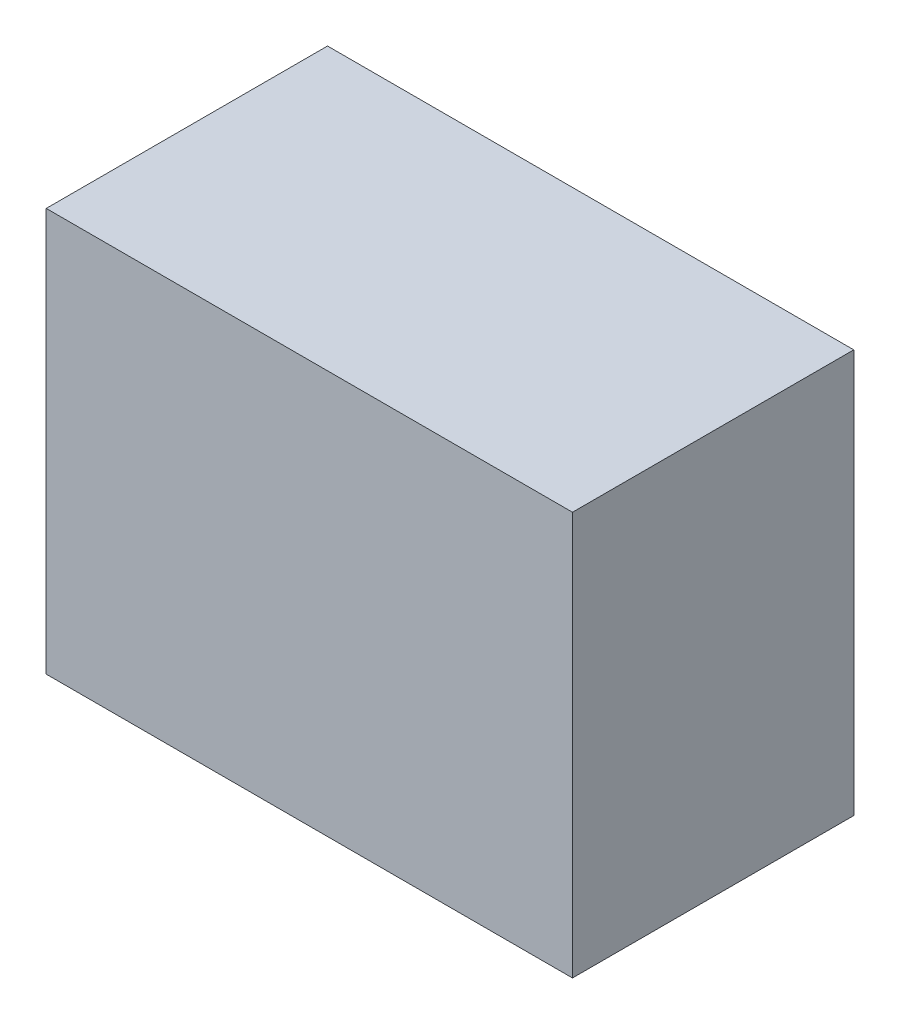
ISO-10303-21;
HEADER;
FILE_DESCRIPTION(('STEP AP214'),'2;1');
FILE_NAME('part.step','',(''),(''),'','','');
FILE_SCHEMA(('AUTOMOTIVE_DESIGN { 1 0 10303 214 1 1 1 1 }'));
ENDSEC;
DATA;
#1=APPLICATION_CONTEXT('core data for automotive mechanical design processes');
#2=APPLICATION_PROTOCOL_DEFINITION('international standard','automotive_design',2000,#1);
#3=PRODUCT_CONTEXT('',#1,'mechanical');
#4=PRODUCT('Part','Part','',(#3));
#5=PRODUCT_RELATED_PRODUCT_CATEGORY('part','',(#4));
#6=PRODUCT_DEFINITION_FORMATION('','',#4);
#7=PRODUCT_DEFINITION_CONTEXT('part definition',#1,'design');
#8=PRODUCT_DEFINITION('design','',#6,#7);
#9=PRODUCT_DEFINITION_SHAPE('','',#8);
#10=(LENGTH_UNIT() NAMED_UNIT(*) SI_UNIT(.MILLI.,.METRE.));
#11=(NAMED_UNIT(*) PLANE_ANGLE_UNIT() SI_UNIT($,.RADIAN.));
#12=(NAMED_UNIT(*) SI_UNIT($,.STERADIAN.) SOLID_ANGLE_UNIT());
#13=UNCERTAINTY_MEASURE_WITH_UNIT(LENGTH_MEASURE(1.E-05),#10,'distance_accuracy_value','');
#14=(GEOMETRIC_REPRESENTATION_CONTEXT(3) GLOBAL_UNCERTAINTY_ASSIGNED_CONTEXT((#13)) GLOBAL_UNIT_ASSIGNED_CONTEXT((#10,
#11,#12)) REPRESENTATION_CONTEXT('',''));
#15=CARTESIAN_POINT('',(0.,0.,0.));
#16=DIRECTION('',(0.,0.,1.));
#17=DIRECTION('',(1.,0.,0.));
#18=AXIS2_PLACEMENT_3D('',#15,#16,#17);
#19=CARTESIAN_POINT('',(49.25,-37.7499999999998,52.65));
#20=DIRECTION('',(-1.,0.,0.));
#21=DIRECTION('',(0.,0.,1.));
#22=AXIS2_PLACEMENT_3D('',#19,#20,#21);
#23=PLANE('',#22);
#24=DIRECTION('',(0.,1.,0.));
#25=VECTOR('',#24,1.);
#26=CARTESIAN_POINT('',(49.25,-37.7499999999998,0.));
#27=LINE('',#26,#25);
#28=CARTESIAN_POINT('',(49.25,-37.7499999999998,0.));
#29=VERTEX_POINT('',#28);
#30=CARTESIAN_POINT('',(49.25,37.7500000000001,0.));
#31=VERTEX_POINT('',#30);
#32=EDGE_CURVE('E113',#29,#31,#27,.T.);
#33=ORIENTED_EDGE('',*,*,#32,.T.);
#34=DIRECTION('',(0.,0.,-1.));
#35=VECTOR('',#34,1.);
#36=CARTESIAN_POINT('',(49.25,37.7500000000001,52.65));
#37=LINE('',#36,#35);
#38=CARTESIAN_POINT('',(49.25,37.7500000000001,52.65));
#39=VERTEX_POINT('',#38);
#40=EDGE_CURVE('E11',#39,#31,#37,.T.);
#41=ORIENTED_EDGE('',*,*,#40,.F.);
#42=DIRECTION('',(0.,1.,0.));
#43=VECTOR('',#42,1.);
#44=CARTESIAN_POINT('',(49.25,-37.7499999999998,52.65));
#45=LINE('',#44,#43);
#46=CARTESIAN_POINT('',(49.25,-37.7499999999998,52.65));
#47=VERTEX_POINT('',#46);
#48=EDGE_CURVE('E97',#47,#39,#45,.T.);
#49=ORIENTED_EDGE('',*,*,#48,.F.);
#50=DIRECTION('',(0.,0.,-1.));
#51=VECTOR('',#50,1.);
#52=CARTESIAN_POINT('',(49.25,-37.7499999999998,52.65));
#53=LINE('',#52,#51);
#54=EDGE_CURVE('E109',#47,#29,#53,.T.);
#55=ORIENTED_EDGE('',*,*,#54,.T.);
#56=EDGE_LOOP('',(#33,#41,#49,#55));
#57=FACE_BOUND('',#56,.T.);
#58=ADVANCED_FACE('F45',(#57),#23,.F.);
#59=CARTESIAN_POINT('',(-49.25,37.7500000000001,52.65));
#60=DIRECTION('',(0.,-1.,0.));
#61=DIRECTION('',(0.,0.,-1.));
#62=AXIS2_PLACEMENT_3D('',#59,#60,#61);
#63=PLANE('',#62);
#64=DIRECTION('',(-1.,0.,0.));
#65=VECTOR('',#64,1.);
#66=CARTESIAN_POINT('',(-49.25,37.7500000000001,0.));
#67=LINE('',#66,#65);
#68=CARTESIAN_POINT('',(-49.25,37.7500000000001,0.));
#69=VERTEX_POINT('',#68);
#70=EDGE_CURVE('E102',#31,#69,#67,.T.);
#71=ORIENTED_EDGE('',*,*,#70,.T.);
#72=DIRECTION('',(0.,0.,-1.));
#73=VECTOR('',#72,1.);
#74=CARTESIAN_POINT('',(-49.25,37.7500000000001,52.65));
#75=LINE('',#74,#73);
#76=CARTESIAN_POINT('',(-49.25,37.7500000000001,52.65));
#77=VERTEX_POINT('',#76);
#78=EDGE_CURVE('E54',#77,#69,#75,.T.);
#79=ORIENTED_EDGE('',*,*,#78,.F.);
#80=DIRECTION('',(-1.,0.,0.));
#81=VECTOR('',#80,1.);
#82=CARTESIAN_POINT('',(-49.25,37.7500000000001,52.65));
#83=LINE('',#82,#81);
#84=EDGE_CURVE('E92',#39,#77,#83,.T.);
#85=ORIENTED_EDGE('',*,*,#84,.F.);
#86=ORIENTED_EDGE('',*,*,#40,.T.);
#87=EDGE_LOOP('',(#71,#79,#85,#86));
#88=FACE_BOUND('',#87,.T.);
#89=ADVANCED_FACE('F101',(#88),#63,.F.);
#90=CARTESIAN_POINT('',(-49.25,-37.7499999999998,52.65));
#91=DIRECTION('',(1.,0.,0.));
#92=DIRECTION('',(0.,0.,-1.));
#93=AXIS2_PLACEMENT_3D('',#90,#91,#92);
#94=PLANE('',#93);
#95=DIRECTION('',(0.,-1.,0.));
#96=VECTOR('',#95,1.);
#97=CARTESIAN_POINT('',(-49.25,-37.7499999999998,0.));
#98=LINE('',#97,#96);
#99=CARTESIAN_POINT('',(-49.25,-37.7499999999998,0.));
#100=VERTEX_POINT('',#99);
#101=EDGE_CURVE('E79',#69,#100,#98,.T.);
#102=ORIENTED_EDGE('',*,*,#101,.T.);
#103=DIRECTION('',(0.,0.,-1.));
#104=VECTOR('',#103,1.);
#105=CARTESIAN_POINT('',(-49.25,-37.7499999999998,52.65));
#106=LINE('',#105,#104);
#107=CARTESIAN_POINT('',(-49.25,-37.7499999999998,52.65));
#108=VERTEX_POINT('',#107);
#109=EDGE_CURVE('E104',#108,#100,#106,.T.);
#110=ORIENTED_EDGE('',*,*,#109,.F.);
#111=DIRECTION('',(0.,-1.,0.));
#112=VECTOR('',#111,1.);
#113=CARTESIAN_POINT('',(-49.25,-37.7499999999998,52.65));
#114=LINE('',#113,#112);
#115=EDGE_CURVE('E95',#77,#108,#114,.T.);
#116=ORIENTED_EDGE('',*,*,#115,.F.);
#117=ORIENTED_EDGE('',*,*,#78,.T.);
#118=EDGE_LOOP('',(#102,#110,#116,#117));
#119=FACE_BOUND('',#118,.T.);
#120=ADVANCED_FACE('F105',(#119),#94,.F.);
#121=CARTESIAN_POINT('',(-49.25,-37.7499999999998,52.65));
#122=DIRECTION('',(0.,1.,0.));
#123=DIRECTION('',(0.,0.,1.));
#124=AXIS2_PLACEMENT_3D('',#121,#122,#123);
#125=PLANE('',#124);
#126=DIRECTION('',(1.,0.,0.));
#127=VECTOR('',#126,1.);
#128=CARTESIAN_POINT('',(-49.25,-37.7499999999998,0.));
#129=LINE('',#128,#127);
#130=EDGE_CURVE('E85',#100,#29,#129,.T.);
#131=ORIENTED_EDGE('',*,*,#130,.T.);
#132=ORIENTED_EDGE('',*,*,#54,.F.);
#133=DIRECTION('',(1.,0.,0.));
#134=VECTOR('',#133,1.);
#135=CARTESIAN_POINT('',(-49.25,-37.7499999999998,52.65));
#136=LINE('',#135,#134);
#137=EDGE_CURVE('E62',#108,#47,#136,.T.);
#138=ORIENTED_EDGE('',*,*,#137,.F.);
#139=ORIENTED_EDGE('',*,*,#109,.T.);
#140=EDGE_LOOP('',(#131,#132,#138,#139));
#141=FACE_BOUND('',#140,.T.);
#142=ADVANCED_FACE('F127',(#141),#125,.F.);
#143=CARTESIAN_POINT('',(0.,0.,52.65));
#144=DIRECTION('',(0.,0.,-1.));
#145=DIRECTION('',(-1.,0.,0.));
#146=AXIS2_PLACEMENT_3D('',#143,#144,#145);
#147=PLANE('',#146);
#148=ORIENTED_EDGE('',*,*,#48,.T.);
#149=ORIENTED_EDGE('',*,*,#84,.T.);
#150=ORIENTED_EDGE('',*,*,#115,.T.);
#151=ORIENTED_EDGE('',*,*,#137,.T.);
#152=EDGE_LOOP('',(#148,#149,#150,#151));
#153=FACE_BOUND('',#152,.T.);
#154=ADVANCED_FACE('F93',(#153),#147,.F.);
#155=CARTESIAN_POINT('',(0.,0.,0.));
#156=DIRECTION('',(0.,0.,-1.));
#157=DIRECTION('',(-1.,0.,0.));
#158=AXIS2_PLACEMENT_3D('',#155,#156,#157);
#159=PLANE('',#158);
#160=CARTESIAN_POINT('',(41.5,-30.,0.));
#161=DIRECTION('',(0.,0.,-1.));
#162=DIRECTION('',(-1.,0.,0.));
#163=AXIS2_PLACEMENT_3D('',#160,#161,#162);
#164=CIRCLE('',#163,3.4);
#165=CARTESIAN_POINT('',(38.1,-30.,0.));
#166=VERTEX_POINT('',#165);
#167=EDGE_CURVE('E138',#166,#166,#164,.T.);
#168=ORIENTED_EDGE('',*,*,#167,.F.);
#169=EDGE_LOOP('',(#168));
#170=FACE_BOUND('',#169,.T.);
#171=CARTESIAN_POINT('',(-41.5,30.,0.));
#172=DIRECTION('',(0.,0.,-1.));
#173=DIRECTION('',(-1.,0.,0.));
#174=AXIS2_PLACEMENT_3D('',#171,#172,#173);
#175=CIRCLE('',#174,3.4);
#176=CARTESIAN_POINT('',(-44.9,30.,0.));
#177=VERTEX_POINT('',#176);
#178=EDGE_CURVE('E146',#177,#177,#175,.T.);
#179=ORIENTED_EDGE('',*,*,#178,.F.);
#180=EDGE_LOOP('',(#179));
#181=FACE_BOUND('',#180,.T.);
#182=CARTESIAN_POINT('',(-41.5,-30.,0.));
#183=DIRECTION('',(0.,0.,-1.));
#184=DIRECTION('',(-1.,0.,0.));
#185=AXIS2_PLACEMENT_3D('',#182,#183,#184);
#186=CIRCLE('',#185,3.4);
#187=CARTESIAN_POINT('',(-44.9,-30.,0.));
#188=VERTEX_POINT('',#187);
#189=EDGE_CURVE('E147',#188,#188,#186,.T.);
#190=ORIENTED_EDGE('',*,*,#189,.F.);
#191=EDGE_LOOP('',(#190));
#192=FACE_BOUND('',#191,.T.);
#193=CARTESIAN_POINT('',(41.5,30.,0.));
#194=DIRECTION('',(0.,0.,-1.));
#195=DIRECTION('',(-1.,0.,0.));
#196=AXIS2_PLACEMENT_3D('',#193,#194,#195);
#197=CIRCLE('',#196,3.4);
#198=CARTESIAN_POINT('',(38.1,30.,0.));
#199=VERTEX_POINT('',#198);
#200=EDGE_CURVE('E134',#199,#199,#197,.T.);
#201=ORIENTED_EDGE('',*,*,#200,.F.);
#202=EDGE_LOOP('',(#201));
#203=FACE_BOUND('',#202,.T.);
#204=ORIENTED_EDGE('',*,*,#32,.F.);
#205=ORIENTED_EDGE('',*,*,#130,.F.);
#206=ORIENTED_EDGE('',*,*,#101,.F.);
#207=ORIENTED_EDGE('',*,*,#70,.F.);
#208=EDGE_LOOP('',(#204,#205,#206,#207));
#209=FACE_BOUND('',#208,.T.);
#210=ADVANCED_FACE('F130',(#170,#181,#192,#203,#209),#159,.T.);
#211=CARTESIAN_POINT('',(41.5,30.,6.35));
#212=DIRECTION('',(0.,0.,-1.));
#213=DIRECTION('',(-1.,0.,0.));
#214=AXIS2_PLACEMENT_3D('',#211,#212,#213);
#215=CYLINDRICAL_SURFACE('',#214,3.4);
#216=CARTESIAN_POINT('',(41.5,30.,6.35));
#217=DIRECTION('',(0.,0.,-1.));
#218=DIRECTION('',(-1.,0.,0.));
#219=AXIS2_PLACEMENT_3D('',#216,#217,#218);
#220=CIRCLE('',#219,3.4);
#221=CARTESIAN_POINT('',(38.1,30.,6.35));
#222=VERTEX_POINT('',#221);
#223=EDGE_CURVE('E117',#222,#222,#220,.T.);
#224=ORIENTED_EDGE('',*,*,#223,.F.);
#225=EDGE_LOOP('',(#224));
#226=FACE_BOUND('',#225,.T.);
#227=ORIENTED_EDGE('',*,*,#200,.T.);
#228=EDGE_LOOP('',(#227));
#229=FACE_BOUND('',#228,.T.);
#230=ADVANCED_FACE('F170',(#226,#229),#215,.F.);
#231=CARTESIAN_POINT('',(41.5,30.,6.35));
#232=DIRECTION('',(0.,0.,-1.));
#233=DIRECTION('',(-1.,0.,0.));
#234=AXIS2_PLACEMENT_3D('',#231,#232,#233);
#235=PLANE('',#234);
#236=ORIENTED_EDGE('',*,*,#223,.T.);
#237=EDGE_LOOP('',(#236));
#238=FACE_BOUND('',#237,.T.);
#239=ADVANCED_FACE('F176',(#238),#235,.T.);
#240=CARTESIAN_POINT('',(-41.5,-30.,6.35));
#241=DIRECTION('',(0.,0.,-1.));
#242=DIRECTION('',(-1.,0.,0.));
#243=AXIS2_PLACEMENT_3D('',#240,#241,#242);
#244=CYLINDRICAL_SURFACE('',#243,3.4);
#245=CARTESIAN_POINT('',(-41.5,-30.,6.35));
#246=DIRECTION('',(0.,0.,-1.));
#247=DIRECTION('',(-1.,0.,0.));
#248=AXIS2_PLACEMENT_3D('',#245,#246,#247);
#249=CIRCLE('',#248,3.4);
#250=CARTESIAN_POINT('',(-44.9,-30.,6.35));
#251=VERTEX_POINT('',#250);
#252=EDGE_CURVE('E158',#251,#251,#249,.T.);
#253=ORIENTED_EDGE('',*,*,#252,.F.);
#254=EDGE_LOOP('',(#253));
#255=FACE_BOUND('',#254,.T.);
#256=ORIENTED_EDGE('',*,*,#189,.T.);
#257=EDGE_LOOP('',(#256));
#258=FACE_BOUND('',#257,.T.);
#259=ADVANCED_FACE('F166',(#255,#258),#244,.F.);
#260=CARTESIAN_POINT('',(-41.5,-30.,6.35));
#261=DIRECTION('',(0.,0.,-1.));
#262=DIRECTION('',(-1.,0.,0.));
#263=AXIS2_PLACEMENT_3D('',#260,#261,#262);
#264=PLANE('',#263);
#265=ORIENTED_EDGE('',*,*,#252,.T.);
#266=EDGE_LOOP('',(#265));
#267=FACE_BOUND('',#266,.T.);
#268=ADVANCED_FACE('F226',(#267),#264,.T.);
#269=CARTESIAN_POINT('',(-41.5,30.,6.35));
#270=DIRECTION('',(0.,0.,-1.));
#271=DIRECTION('',(-1.,0.,0.));
#272=AXIS2_PLACEMENT_3D('',#269,#270,#271);
#273=CYLINDRICAL_SURFACE('',#272,3.4);
#274=CARTESIAN_POINT('',(-41.5,30.,6.35));
#275=DIRECTION('',(0.,0.,-1.));
#276=DIRECTION('',(-1.,0.,0.));
#277=AXIS2_PLACEMENT_3D('',#274,#275,#276);
#278=CIRCLE('',#277,3.4);
#279=CARTESIAN_POINT('',(-44.9,30.,6.35));
#280=VERTEX_POINT('',#279);
#281=EDGE_CURVE('E142',#280,#280,#278,.T.);
#282=ORIENTED_EDGE('',*,*,#281,.F.);
#283=EDGE_LOOP('',(#282));
#284=FACE_BOUND('',#283,.T.);
#285=ORIENTED_EDGE('',*,*,#178,.T.);
#286=EDGE_LOOP('',(#285));
#287=FACE_BOUND('',#286,.T.);
#288=ADVANCED_FACE('F236',(#284,#287),#273,.F.);
#289=CARTESIAN_POINT('',(-41.5,30.,6.35));
#290=DIRECTION('',(0.,0.,-1.));
#291=DIRECTION('',(-1.,0.,0.));
#292=AXIS2_PLACEMENT_3D('',#289,#290,#291);
#293=PLANE('',#292);
#294=ORIENTED_EDGE('',*,*,#281,.T.);
#295=EDGE_LOOP('',(#294));
#296=FACE_BOUND('',#295,.T.);
#297=ADVANCED_FACE('F246',(#296),#293,.T.);
#298=CARTESIAN_POINT('',(41.5,-30.,6.35));
#299=DIRECTION('',(0.,0.,-1.));
#300=DIRECTION('',(-1.,0.,0.));
#301=AXIS2_PLACEMENT_3D('',#298,#299,#300);
#302=CYLINDRICAL_SURFACE('',#301,3.4);
#303=CARTESIAN_POINT('',(41.5,-30.,6.35));
#304=DIRECTION('',(0.,0.,-1.));
#305=DIRECTION('',(-1.,0.,0.));
#306=AXIS2_PLACEMENT_3D('',#303,#304,#305);
#307=CIRCLE('',#306,3.4);
#308=CARTESIAN_POINT('',(38.1,-30.,6.35));
#309=VERTEX_POINT('',#308);
#310=EDGE_CURVE('E151',#309,#309,#307,.T.);
#311=ORIENTED_EDGE('',*,*,#310,.F.);
#312=EDGE_LOOP('',(#311));
#313=FACE_BOUND('',#312,.T.);
#314=ORIENTED_EDGE('',*,*,#167,.T.);
#315=EDGE_LOOP('',(#314));
#316=FACE_BOUND('',#315,.T.);
#317=ADVANCED_FACE('F256',(#313,#316),#302,.F.);
#318=CARTESIAN_POINT('',(41.5,-30.,6.35));
#319=DIRECTION('',(0.,0.,-1.));
#320=DIRECTION('',(-1.,0.,0.));
#321=AXIS2_PLACEMENT_3D('',#318,#319,#320);
#322=PLANE('',#321);
#323=ORIENTED_EDGE('',*,*,#310,.T.);
#324=EDGE_LOOP('',(#323));
#325=FACE_BOUND('',#324,.T.);
#326=ADVANCED_FACE('F266',(#325),#322,.T.);
#327=CLOSED_SHELL('',(#58,#89,#120,#142,#154,#210,#230,#239,#259,#268,#288,#297,#317,#326));
#328=MANIFOLD_SOLID_BREP('B2',#327);
#329=ADVANCED_BREP_SHAPE_REPRESENTATION('',(#18,#328),#14);
#330=SHAPE_DEFINITION_REPRESENTATION(#9,#329);
ENDSEC;
END-ISO-10303-21;
